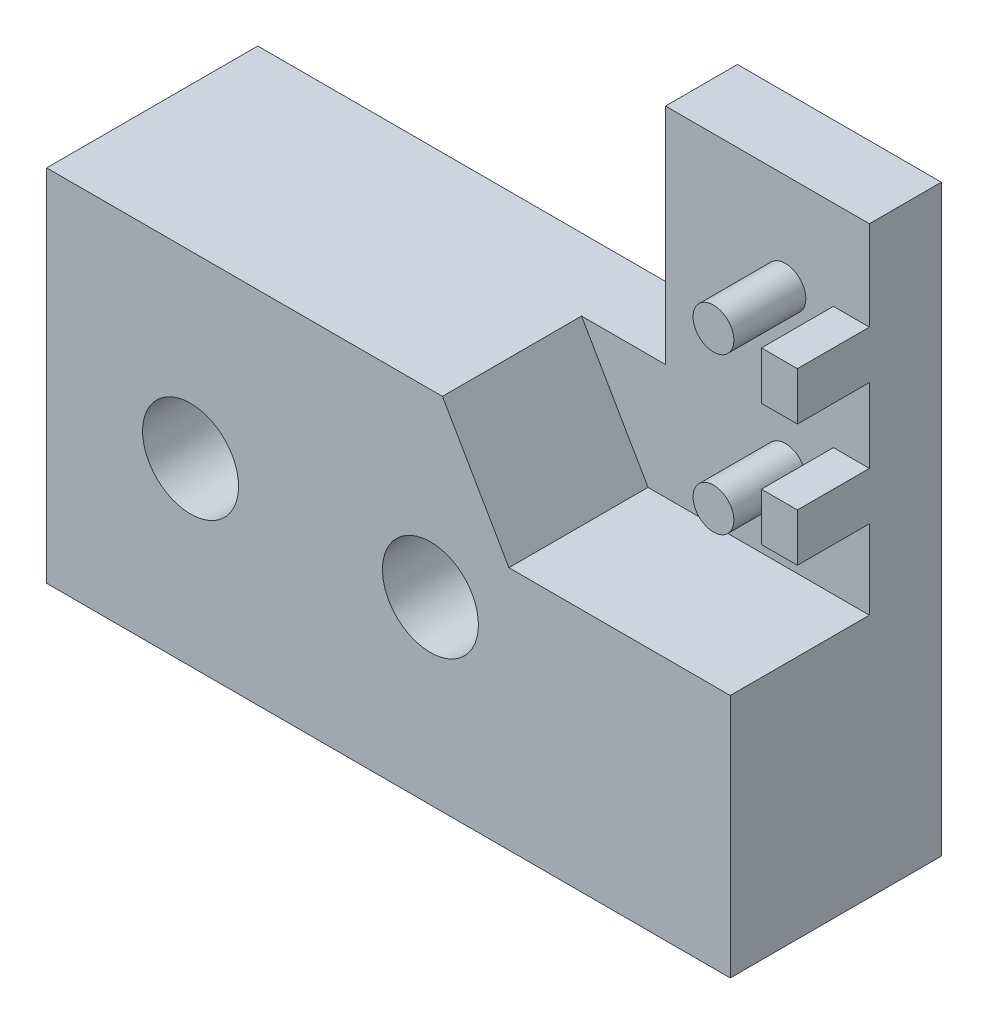
ISO-10303-21;
HEADER;
FILE_DESCRIPTION(('STEP AP214'),'2;1');
FILE_NAME('part.step','',(''),(''),'','','');
FILE_SCHEMA(('AUTOMOTIVE_DESIGN { 1 0 10303 214 1 1 1 1 }'));
ENDSEC;
DATA;
#1=APPLICATION_CONTEXT('core data for automotive mechanical design processes');
#2=APPLICATION_PROTOCOL_DEFINITION('international standard','automotive_design',2000,#1);
#3=PRODUCT_CONTEXT('',#1,'mechanical');
#4=PRODUCT('Part','Part','',(#3));
#5=PRODUCT_RELATED_PRODUCT_CATEGORY('part','',(#4));
#6=PRODUCT_DEFINITION_FORMATION('','',#4);
#7=PRODUCT_DEFINITION_CONTEXT('part definition',#1,'design');
#8=PRODUCT_DEFINITION('design','',#6,#7);
#9=PRODUCT_DEFINITION_SHAPE('','',#8);
#10=(LENGTH_UNIT() NAMED_UNIT(*) SI_UNIT(.MILLI.,.METRE.));
#11=(NAMED_UNIT(*) PLANE_ANGLE_UNIT() SI_UNIT($,.RADIAN.));
#12=(NAMED_UNIT(*) SI_UNIT($,.STERADIAN.) SOLID_ANGLE_UNIT());
#13=UNCERTAINTY_MEASURE_WITH_UNIT(LENGTH_MEASURE(1.E-05),#10,'distance_accuracy_value','');
#14=(GEOMETRIC_REPRESENTATION_CONTEXT(3) GLOBAL_UNCERTAINTY_ASSIGNED_CONTEXT((#13)) GLOBAL_UNIT_ASSIGNED_CONTEXT((#10,
#11,#12)) REPRESENTATION_CONTEXT('',''));
#15=CARTESIAN_POINT('',(0.,0.,0.));
#16=DIRECTION('',(0.,0.,1.));
#17=DIRECTION('',(1.,0.,0.));
#18=AXIS2_PLACEMENT_3D('',#15,#16,#17);
#19=CARTESIAN_POINT('',(0.,0.,3.));
#20=DIRECTION('',(0.,0.,-1.));
#21=DIRECTION('',(-1.,0.,0.));
#22=AXIS2_PLACEMENT_3D('',#19,#20,#21);
#23=PLANE('',#22);
#24=CARTESIAN_POINT('',(-3.5,20.3,3.));
#25=DIRECTION('',(0.,0.,-1.));
#26=DIRECTION('',(-1.,0.,0.));
#27=AXIS2_PLACEMENT_3D('',#24,#25,#26);
#28=CIRCLE('',#27,0.85);
#29=CARTESIAN_POINT('',(-4.35,20.3,3.));
#30=VERTEX_POINT('',#29);
#31=EDGE_CURVE('E11',#30,#30,#28,.F.);
#32=ORIENTED_EDGE('',*,*,#31,.F.);
#33=EDGE_LOOP('',(#32));
#34=FACE_BOUND('',#33,.T.);
#35=CARTESIAN_POINT('',(-3.5,13.8,3.));
#36=DIRECTION('',(0.,0.,-1.));
#37=DIRECTION('',(-1.,0.,0.));
#38=AXIS2_PLACEMENT_3D('',#35,#36,#37);
#39=CIRCLE('',#38,0.85);
#40=CARTESIAN_POINT('',(-4.35,13.8,3.));
#41=VERTEX_POINT('',#40);
#42=EDGE_CURVE('E54',#41,#41,#39,.F.);
#43=ORIENTED_EDGE('',*,*,#42,.F.);
#44=EDGE_LOOP('',(#43));
#45=FACE_BOUND('',#44,.T.);
#46=DIRECTION('',(0.,1.,0.));
#47=VECTOR('',#46,1.);
#48=CARTESIAN_POINT('',(-1.5,0.,3.));
#49=LINE('',#48,#47);
#50=CARTESIAN_POINT('',(-1.5,13.5,3.));
#51=VERTEX_POINT('',#50);
#52=CARTESIAN_POINT('',(-1.5,15.5,3.));
#53=VERTEX_POINT('',#52);
#54=EDGE_CURVE('E61',#51,#53,#49,.T.);
#55=ORIENTED_EDGE('',*,*,#54,.T.);
#56=DIRECTION('',(1.,0.,0.));
#57=VECTOR('',#56,1.);
#58=CARTESIAN_POINT('',(0.,15.5,3.));
#59=LINE('',#58,#57);
#60=CARTESIAN_POINT('',(0.,15.5,3.));
#61=VERTEX_POINT('',#60);
#62=EDGE_CURVE('E170',#53,#61,#59,.T.);
#63=ORIENTED_EDGE('',*,*,#62,.T.);
#64=DIRECTION('',(0.,1.,0.));
#65=VECTOR('',#64,1.);
#66=CARTESIAN_POINT('',(0.,24.333,3.));
#67=LINE('',#66,#65);
#68=CARTESIAN_POINT('',(0.,18.6,3.));
#69=VERTEX_POINT('',#68);
#70=EDGE_CURVE('E300',#61,#69,#67,.T.);
#71=ORIENTED_EDGE('',*,*,#70,.T.);
#72=DIRECTION('',(1.,0.,0.));
#73=VECTOR('',#72,1.);
#74=CARTESIAN_POINT('',(0.,18.6,3.));
#75=LINE('',#74,#73);
#76=CARTESIAN_POINT('',(-1.5,18.6,3.));
#77=VERTEX_POINT('',#76);
#78=EDGE_CURVE('E219',#77,#69,#75,.T.);
#79=ORIENTED_EDGE('',*,*,#78,.F.);
#80=DIRECTION('',(0.,-1.,0.));
#81=VECTOR('',#80,1.);
#82=CARTESIAN_POINT('',(-1.5,0.,3.));
#83=LINE('',#82,#81);
#84=CARTESIAN_POINT('',(-1.5,20.6,3.));
#85=VERTEX_POINT('',#84);
#86=EDGE_CURVE('E232',#85,#77,#83,.T.);
#87=ORIENTED_EDGE('',*,*,#86,.F.);
#88=DIRECTION('',(-1.,0.,0.));
#89=VECTOR('',#88,1.);
#90=CARTESIAN_POINT('',(0.,20.6,3.));
#91=LINE('',#90,#89);
#92=CARTESIAN_POINT('',(0.,20.6,3.));
#93=VERTEX_POINT('',#92);
#94=EDGE_CURVE('E174',#93,#85,#91,.T.);
#95=ORIENTED_EDGE('',*,*,#94,.F.);
#96=CARTESIAN_POINT('',(0.,24.333,3.));
#97=VERTEX_POINT('',#96);
#98=EDGE_CURVE('E301',#93,#97,#67,.T.);
#99=ORIENTED_EDGE('',*,*,#98,.T.);
#100=DIRECTION('',(-1.,0.,0.));
#101=VECTOR('',#100,1.);
#102=CARTESIAN_POINT('',(-8.5,24.333,3.));
#103=LINE('',#102,#101);
#104=CARTESIAN_POINT('',(-8.5,24.333,3.));
#105=VERTEX_POINT('',#104);
#106=EDGE_CURVE('E299',#97,#105,#103,.T.);
#107=ORIENTED_EDGE('',*,*,#106,.T.);
#108=DIRECTION('',(0.,-1.,0.));
#109=VECTOR('',#108,1.);
#110=CARTESIAN_POINT('',(-8.5,15.,3.));
#111=LINE('',#110,#109);
#112=CARTESIAN_POINT('',(-8.5,15.,3.));
#113=VERTEX_POINT('',#112);
#114=EDGE_CURVE('E304',#105,#113,#111,.T.);
#115=ORIENTED_EDGE('',*,*,#114,.T.);
#116=DIRECTION('',(-1.,0.,0.));
#117=VECTOR('',#116,1.);
#118=CARTESIAN_POINT('',(-28.5,15.,3.));
#119=LINE('',#118,#117);
#120=CARTESIAN_POINT('',(-12.,15.,3.));
#121=VERTEX_POINT('',#120);
#122=EDGE_CURVE('E307',#113,#121,#119,.T.);
#123=ORIENTED_EDGE('',*,*,#122,.T.);
#124=DIRECTION('',(-0.499999999999998,0.86602540378444,0.));
#125=VECTOR('',#124,1.);
#126=CARTESIAN_POINT('',(-12.,15.,3.));
#127=LINE('',#126,#125);
#128=CARTESIAN_POINT('',(-9.22871870788981,10.2,3.));
#129=VERTEX_POINT('',#128);
#130=EDGE_CURVE('E260',#129,#121,#127,.T.);
#131=ORIENTED_EDGE('',*,*,#130,.F.);
#132=DIRECTION('',(-1.,0.,0.));
#133=VECTOR('',#132,1.);
#134=CARTESIAN_POINT('',(-9.22871870788981,10.2,3.));
#135=LINE('',#134,#133);
#136=CARTESIAN_POINT('',(0.,10.2,3.));
#137=VERTEX_POINT('',#136);
#138=EDGE_CURVE('E254',#137,#129,#135,.T.);
#139=ORIENTED_EDGE('',*,*,#138,.F.);
#140=CARTESIAN_POINT('',(0.,13.5,3.));
#141=VERTEX_POINT('',#140);
#142=EDGE_CURVE('E296',#137,#141,#67,.T.);
#143=ORIENTED_EDGE('',*,*,#142,.T.);
#144=DIRECTION('',(-1.,0.,0.));
#145=VECTOR('',#144,1.);
#146=CARTESIAN_POINT('',(0.,13.5,3.));
#147=LINE('',#146,#145);
#148=EDGE_CURVE('E66',#141,#51,#147,.T.);
#149=ORIENTED_EDGE('',*,*,#148,.T.);
#150=EDGE_LOOP('',(#55,#63,#71,#79,#87,#95,#99,#107,#115,#123,#131,#139,#143,#149));
#151=FACE_BOUND('',#150,.T.);
#152=ADVANCED_FACE('F45',(#34,#45,#151),#23,.F.);
#153=CARTESIAN_POINT('',(0.,24.333,3.));
#154=DIRECTION('',(-1.,0.,0.));
#155=DIRECTION('',(0.,-1.,0.));
#156=AXIS2_PLACEMENT_3D('',#153,#154,#155);
#157=PLANE('',#156);
#158=DIRECTION('',(0.,1.,0.));
#159=VECTOR('',#158,1.);
#160=CARTESIAN_POINT('',(0.,24.333,0.));
#161=LINE('',#160,#159);
#162=CARTESIAN_POINT('',(0.,0.,0.));
#163=VERTEX_POINT('',#162);
#164=CARTESIAN_POINT('',(0.,24.333,0.));
#165=VERTEX_POINT('',#164);
#166=EDGE_CURVE('E295',#163,#165,#161,.T.);
#167=ORIENTED_EDGE('',*,*,#166,.T.);
#168=DIRECTION('',(0.,0.,-1.));
#169=VECTOR('',#168,1.);
#170=CARTESIAN_POINT('',(0.,24.333,3.));
#171=LINE('',#170,#169);
#172=EDGE_CURVE('E348',#97,#165,#171,.T.);
#173=ORIENTED_EDGE('',*,*,#172,.F.);
#174=ORIENTED_EDGE('',*,*,#98,.F.);
#175=DIRECTION('',(0.,0.,-1.));
#176=VECTOR('',#175,1.);
#177=CARTESIAN_POINT('',(0.,20.6,6.));
#178=LINE('',#177,#176);
#179=CARTESIAN_POINT('',(0.,20.6,6.));
#180=VERTEX_POINT('',#179);
#181=EDGE_CURVE('E250',#180,#93,#178,.T.);
#182=ORIENTED_EDGE('',*,*,#181,.F.);
#183=DIRECTION('',(0.,1.,0.));
#184=VECTOR('',#183,1.);
#185=CARTESIAN_POINT('',(0.,0.,6.));
#186=LINE('',#185,#184);
#187=CARTESIAN_POINT('',(0.,18.6,6.));
#188=VERTEX_POINT('',#187);
#189=EDGE_CURVE('E214',#188,#180,#186,.T.);
#190=ORIENTED_EDGE('',*,*,#189,.F.);
#191=DIRECTION('',(0.,0.,-1.));
#192=VECTOR('',#191,1.);
#193=CARTESIAN_POINT('',(0.,18.6,6.));
#194=LINE('',#193,#192);
#195=EDGE_CURVE('E228',#188,#69,#194,.T.);
#196=ORIENTED_EDGE('',*,*,#195,.T.);
#197=ORIENTED_EDGE('',*,*,#70,.F.);
#198=DIRECTION('',(0.,0.,-1.));
#199=VECTOR('',#198,1.);
#200=CARTESIAN_POINT('',(0.,15.5,6.));
#201=LINE('',#200,#199);
#202=CARTESIAN_POINT('',(0.,15.5,6.));
#203=VERTEX_POINT('',#202);
#204=EDGE_CURVE('E198',#203,#61,#201,.T.);
#205=ORIENTED_EDGE('',*,*,#204,.F.);
#206=DIRECTION('',(0.,1.,0.));
#207=VECTOR('',#206,1.);
#208=CARTESIAN_POINT('',(0.,0.,6.));
#209=LINE('',#208,#207);
#210=CARTESIAN_POINT('',(0.,13.5,6.));
#211=VERTEX_POINT('',#210);
#212=EDGE_CURVE('E184',#211,#203,#209,.T.);
#213=ORIENTED_EDGE('',*,*,#212,.F.);
#214=DIRECTION('',(0.,0.,-1.));
#215=VECTOR('',#214,1.);
#216=CARTESIAN_POINT('',(0.,13.5,6.));
#217=LINE('',#216,#215);
#218=EDGE_CURVE('E208',#211,#141,#217,.T.);
#219=ORIENTED_EDGE('',*,*,#218,.T.);
#220=ORIENTED_EDGE('',*,*,#142,.F.);
#221=DIRECTION('',(0.,0.,-1.));
#222=VECTOR('',#221,1.);
#223=CARTESIAN_POINT('',(0.,10.2,8.8));
#224=LINE('',#223,#222);
#225=CARTESIAN_POINT('',(0.,10.2,8.8));
#226=VERTEX_POINT('',#225);
#227=EDGE_CURVE('E291',#226,#137,#224,.T.);
#228=ORIENTED_EDGE('',*,*,#227,.F.);
#229=DIRECTION('',(0.,1.,0.));
#230=VECTOR('',#229,1.);
#231=CARTESIAN_POINT('',(0.,0.,8.8));
#232=LINE('',#231,#230);
#233=CARTESIAN_POINT('',(0.,0.,8.8));
#234=VERTEX_POINT('',#233);
#235=EDGE_CURVE('E268',#234,#226,#232,.T.);
#236=ORIENTED_EDGE('',*,*,#235,.F.);
#237=DIRECTION('',(0.,0.,-1.));
#238=VECTOR('',#237,1.);
#239=CARTESIAN_POINT('',(0.,0.,3.));
#240=LINE('',#239,#238);
#241=EDGE_CURVE('E310',#234,#163,#240,.T.);
#242=ORIENTED_EDGE('',*,*,#241,.T.);
#243=EDGE_LOOP('',(#167,#173,#174,#182,#190,#196,#197,#205,#213,#219,#220,#228,#236,#242));
#244=FACE_BOUND('',#243,.T.);
#245=ADVANCED_FACE('F47',(#244),#157,.F.);
#246=CARTESIAN_POINT('',(-8.5,24.333,3.));
#247=DIRECTION('',(0.,-1.,0.));
#248=DIRECTION('',(0.,0.,-1.));
#249=AXIS2_PLACEMENT_3D('',#246,#247,#248);
#250=PLANE('',#249);
#251=DIRECTION('',(-1.,0.,0.));
#252=VECTOR('',#251,1.);
#253=CARTESIAN_POINT('',(-8.5,24.333,0.));
#254=LINE('',#253,#252);
#255=CARTESIAN_POINT('',(-8.5,24.333,0.));
#256=VERTEX_POINT('',#255);
#257=EDGE_CURVE('E314',#165,#256,#254,.T.);
#258=ORIENTED_EDGE('',*,*,#257,.T.);
#259=DIRECTION('',(0.,0.,-1.));
#260=VECTOR('',#259,1.);
#261=CARTESIAN_POINT('',(-8.5,24.333,3.));
#262=LINE('',#261,#260);
#263=EDGE_CURVE('E344',#105,#256,#262,.T.);
#264=ORIENTED_EDGE('',*,*,#263,.F.);
#265=ORIENTED_EDGE('',*,*,#106,.F.);
#266=ORIENTED_EDGE('',*,*,#172,.T.);
#267=EDGE_LOOP('',(#258,#264,#265,#266));
#268=FACE_BOUND('',#267,.T.);
#269=ADVANCED_FACE('F363',(#268),#250,.F.);
#270=CARTESIAN_POINT('',(-8.5,15.,3.));
#271=DIRECTION('',(1.,0.,0.));
#272=DIRECTION('',(0.,0.,-1.));
#273=AXIS2_PLACEMENT_3D('',#270,#271,#272);
#274=PLANE('',#273);
#275=DIRECTION('',(0.,-1.,0.));
#276=VECTOR('',#275,1.);
#277=CARTESIAN_POINT('',(-8.5,15.,0.));
#278=LINE('',#277,#276);
#279=CARTESIAN_POINT('',(-8.5,15.,0.));
#280=VERTEX_POINT('',#279);
#281=EDGE_CURVE('E317',#256,#280,#278,.T.);
#282=ORIENTED_EDGE('',*,*,#281,.T.);
#283=DIRECTION('',(0.,0.,-1.));
#284=VECTOR('',#283,1.);
#285=CARTESIAN_POINT('',(-8.5,15.,3.));
#286=LINE('',#285,#284);
#287=EDGE_CURVE('E340',#113,#280,#286,.T.);
#288=ORIENTED_EDGE('',*,*,#287,.F.);
#289=ORIENTED_EDGE('',*,*,#114,.F.);
#290=ORIENTED_EDGE('',*,*,#263,.T.);
#291=EDGE_LOOP('',(#282,#288,#289,#290));
#292=FACE_BOUND('',#291,.T.);
#293=ADVANCED_FACE('F385',(#292),#274,.F.);
#294=CARTESIAN_POINT('',(-28.5,15.,3.));
#295=DIRECTION('',(0.,-1.,0.));
#296=DIRECTION('',(0.,0.,-1.));
#297=AXIS2_PLACEMENT_3D('',#294,#295,#296);
#298=PLANE('',#297);
#299=DIRECTION('',(-1.,0.,0.));
#300=VECTOR('',#299,1.);
#301=CARTESIAN_POINT('',(-28.5,15.,0.));
#302=LINE('',#301,#300);
#303=CARTESIAN_POINT('',(-28.5,15.,0.));
#304=VERTEX_POINT('',#303);
#305=EDGE_CURVE('E320',#280,#304,#302,.T.);
#306=ORIENTED_EDGE('',*,*,#305,.T.);
#307=DIRECTION('',(0.,0.,-1.));
#308=VECTOR('',#307,1.);
#309=CARTESIAN_POINT('',(-28.5,15.,3.));
#310=LINE('',#309,#308);
#311=CARTESIAN_POINT('',(-28.5,15.,8.8));
#312=VERTEX_POINT('',#311);
#313=EDGE_CURVE('E336',#312,#304,#310,.T.);
#314=ORIENTED_EDGE('',*,*,#313,.F.);
#315=DIRECTION('',(-1.,0.,0.));
#316=VECTOR('',#315,1.);
#317=CARTESIAN_POINT('',(-12.,15.,8.8));
#318=LINE('',#317,#316);
#319=CARTESIAN_POINT('',(-12.,15.,8.8));
#320=VERTEX_POINT('',#319);
#321=EDGE_CURVE('E255',#320,#312,#318,.T.);
#322=ORIENTED_EDGE('',*,*,#321,.F.);
#323=DIRECTION('',(0.,0.,-1.));
#324=VECTOR('',#323,1.);
#325=CARTESIAN_POINT('',(-12.,15.,8.8));
#326=LINE('',#325,#324);
#327=EDGE_CURVE('E277',#320,#121,#326,.T.);
#328=ORIENTED_EDGE('',*,*,#327,.T.);
#329=ORIENTED_EDGE('',*,*,#122,.F.);
#330=ORIENTED_EDGE('',*,*,#287,.T.);
#331=EDGE_LOOP('',(#306,#314,#322,#328,#329,#330));
#332=FACE_BOUND('',#331,.T.);
#333=ADVANCED_FACE('F381',(#332),#298,.F.);
#334=CARTESIAN_POINT('',(-28.5,0.,3.));
#335=DIRECTION('',(1.,0.,0.));
#336=DIRECTION('',(0.,0.,-1.));
#337=AXIS2_PLACEMENT_3D('',#334,#335,#336);
#338=PLANE('',#337);
#339=DIRECTION('',(0.,-1.,0.));
#340=VECTOR('',#339,1.);
#341=CARTESIAN_POINT('',(-28.5,0.,0.));
#342=LINE('',#341,#340);
#343=CARTESIAN_POINT('',(-28.5,0.,0.));
#344=VERTEX_POINT('',#343);
#345=EDGE_CURVE('E323',#304,#344,#342,.T.);
#346=ORIENTED_EDGE('',*,*,#345,.T.);
#347=DIRECTION('',(0.,0.,-1.));
#348=VECTOR('',#347,1.);
#349=CARTESIAN_POINT('',(-28.5,0.,3.));
#350=LINE('',#349,#348);
#351=CARTESIAN_POINT('',(-28.5,0.,8.8));
#352=VERTEX_POINT('',#351);
#353=EDGE_CURVE('E332',#352,#344,#350,.T.);
#354=ORIENTED_EDGE('',*,*,#353,.F.);
#355=DIRECTION('',(0.,-1.,0.));
#356=VECTOR('',#355,1.);
#357=CARTESIAN_POINT('',(-28.5,15.,8.8));
#358=LINE('',#357,#356);
#359=EDGE_CURVE('E259',#312,#352,#358,.T.);
#360=ORIENTED_EDGE('',*,*,#359,.F.);
#361=ORIENTED_EDGE('',*,*,#313,.T.);
#362=EDGE_LOOP('',(#346,#354,#360,#361));
#363=FACE_BOUND('',#362,.T.);
#364=ADVANCED_FACE('F377',(#363),#338,.F.);
#365=CARTESIAN_POINT('',(0.,0.,3.));
#366=DIRECTION('',(0.,1.,0.));
#367=DIRECTION('',(0.,0.,1.));
#368=AXIS2_PLACEMENT_3D('',#365,#366,#367);
#369=PLANE('',#368);
#370=DIRECTION('',(1.,0.,0.));
#371=VECTOR('',#370,1.);
#372=CARTESIAN_POINT('',(0.,0.,0.));
#373=LINE('',#372,#371);
#374=EDGE_CURVE('E326',#344,#163,#373,.T.);
#375=ORIENTED_EDGE('',*,*,#374,.T.);
#376=ORIENTED_EDGE('',*,*,#241,.F.);
#377=DIRECTION('',(1.,0.,0.));
#378=VECTOR('',#377,1.);
#379=CARTESIAN_POINT('',(-28.5,0.,8.8));
#380=LINE('',#379,#378);
#381=EDGE_CURVE('E264',#352,#234,#380,.T.);
#382=ORIENTED_EDGE('',*,*,#381,.F.);
#383=ORIENTED_EDGE('',*,*,#353,.T.);
#384=EDGE_LOOP('',(#375,#376,#382,#383));
#385=FACE_BOUND('',#384,.T.);
#386=ADVANCED_FACE('F373',(#385),#369,.F.);
#387=CARTESIAN_POINT('',(0.,0.,0.));
#388=DIRECTION('',(0.,0.,-1.));
#389=DIRECTION('',(-1.,0.,0.));
#390=AXIS2_PLACEMENT_3D('',#387,#388,#389);
#391=PLANE('',#390);
#392=CARTESIAN_POINT('',(-22.5,7.5,0.));
#393=DIRECTION('',(0.,0.,-1.));
#394=DIRECTION('',(-1.,0.,0.));
#395=AXIS2_PLACEMENT_3D('',#392,#393,#394);
#396=CIRCLE('',#395,2.);
#397=CARTESIAN_POINT('',(-24.5,7.5,0.));
#398=VERTEX_POINT('',#397);
#399=EDGE_CURVE('E690',#398,#398,#396,.F.);
#400=ORIENTED_EDGE('',*,*,#399,.T.);
#401=EDGE_LOOP('',(#400));
#402=FACE_BOUND('',#401,.T.);
#403=CARTESIAN_POINT('',(-12.5,7.5,0.));
#404=DIRECTION('',(0.,0.,-1.));
#405=DIRECTION('',(-1.,0.,0.));
#406=AXIS2_PLACEMENT_3D('',#403,#404,#405);
#407=CIRCLE('',#406,2.);
#408=CARTESIAN_POINT('',(-14.5,7.5,0.));
#409=VERTEX_POINT('',#408);
#410=EDGE_CURVE('E698',#409,#409,#407,.F.);
#411=ORIENTED_EDGE('',*,*,#410,.T.);
#412=EDGE_LOOP('',(#411));
#413=FACE_BOUND('',#412,.T.);
#414=ORIENTED_EDGE('',*,*,#166,.F.);
#415=ORIENTED_EDGE('',*,*,#374,.F.);
#416=ORIENTED_EDGE('',*,*,#345,.F.);
#417=ORIENTED_EDGE('',*,*,#305,.F.);
#418=ORIENTED_EDGE('',*,*,#281,.F.);
#419=ORIENTED_EDGE('',*,*,#257,.F.);
#420=EDGE_LOOP('',(#414,#415,#416,#417,#418,#419));
#421=FACE_BOUND('',#420,.T.);
#422=ADVANCED_FACE('F370',(#402,#413,#421),#391,.T.);
#423=CARTESIAN_POINT('',(-9.22871870788981,10.2,8.8));
#424=DIRECTION('',(0.,-1.,0.));
#425=DIRECTION('',(0.,0.,-1.));
#426=AXIS2_PLACEMENT_3D('',#423,#424,#425);
#427=PLANE('',#426);
#428=ORIENTED_EDGE('',*,*,#138,.T.);
#429=DIRECTION('',(0.,0.,-1.));
#430=VECTOR('',#429,1.);
#431=CARTESIAN_POINT('',(-9.22871870788981,10.2,8.8));
#432=LINE('',#431,#430);
#433=CARTESIAN_POINT('',(-9.22871870788981,10.2,8.8));
#434=VERTEX_POINT('',#433);
#435=EDGE_CURVE('E287',#434,#129,#432,.T.);
#436=ORIENTED_EDGE('',*,*,#435,.F.);
#437=DIRECTION('',(-1.,0.,0.));
#438=VECTOR('',#437,1.);
#439=CARTESIAN_POINT('',(-9.22871870788981,10.2,8.8));
#440=LINE('',#439,#438);
#441=EDGE_CURVE('E271',#226,#434,#440,.T.);
#442=ORIENTED_EDGE('',*,*,#441,.F.);
#443=ORIENTED_EDGE('',*,*,#227,.T.);
#444=EDGE_LOOP('',(#428,#436,#442,#443));
#445=FACE_BOUND('',#444,.T.);
#446=ADVANCED_FACE('F368',(#445),#427,.F.);
#447=CARTESIAN_POINT('',(-12.,15.,8.8));
#448=DIRECTION('',(-0.86602540378444,-0.499999999999998,0.));
#449=DIRECTION('',(0.499999999999998,-0.86602540378444,0.));
#450=AXIS2_PLACEMENT_3D('',#447,#448,#449);
#451=PLANE('',#450);
#452=ORIENTED_EDGE('',*,*,#130,.T.);
#453=ORIENTED_EDGE('',*,*,#327,.F.);
#454=DIRECTION('',(-0.499999999999998,0.86602540378444,0.));
#455=VECTOR('',#454,1.);
#456=CARTESIAN_POINT('',(-12.,15.,8.8));
#457=LINE('',#456,#455);
#458=EDGE_CURVE('E274',#434,#320,#457,.T.);
#459=ORIENTED_EDGE('',*,*,#458,.F.);
#460=ORIENTED_EDGE('',*,*,#435,.T.);
#461=EDGE_LOOP('',(#452,#453,#459,#460));
#462=FACE_BOUND('',#461,.T.);
#463=ADVANCED_FACE('F413',(#462),#451,.F.);
#464=CARTESIAN_POINT('',(0.,0.,8.8));
#465=DIRECTION('',(0.,0.,1.));
#466=DIRECTION('',(1.,0.,0.));
#467=AXIS2_PLACEMENT_3D('',#464,#465,#466);
#468=PLANE('',#467);
#469=CARTESIAN_POINT('',(-22.5,7.5,8.8));
#470=DIRECTION('',(0.,0.,1.));
#471=DIRECTION('',(1.,0.,0.));
#472=AXIS2_PLACEMENT_3D('',#469,#470,#471);
#473=CIRCLE('',#472,2.);
#474=CARTESIAN_POINT('',(-20.5,7.5,8.8));
#475=VERTEX_POINT('',#474);
#476=EDGE_CURVE('E687',#475,#475,#473,.T.);
#477=ORIENTED_EDGE('',*,*,#476,.F.);
#478=EDGE_LOOP('',(#477));
#479=FACE_BOUND('',#478,.T.);
#480=CARTESIAN_POINT('',(-12.5,7.5,8.8));
#481=DIRECTION('',(0.,0.,1.));
#482=DIRECTION('',(1.,0.,0.));
#483=AXIS2_PLACEMENT_3D('',#480,#481,#482);
#484=CIRCLE('',#483,2.);
#485=CARTESIAN_POINT('',(-10.5,7.5,8.8));
#486=VERTEX_POINT('',#485);
#487=EDGE_CURVE('E701',#486,#486,#484,.T.);
#488=ORIENTED_EDGE('',*,*,#487,.F.);
#489=EDGE_LOOP('',(#488));
#490=FACE_BOUND('',#489,.T.);
#491=ORIENTED_EDGE('',*,*,#321,.T.);
#492=ORIENTED_EDGE('',*,*,#359,.T.);
#493=ORIENTED_EDGE('',*,*,#381,.T.);
#494=ORIENTED_EDGE('',*,*,#235,.T.);
#495=ORIENTED_EDGE('',*,*,#441,.T.);
#496=ORIENTED_EDGE('',*,*,#458,.T.);
#497=EDGE_LOOP('',(#491,#492,#493,#494,#495,#496));
#498=FACE_BOUND('',#497,.T.);
#499=ADVANCED_FACE('F409',(#479,#490,#498),#468,.T.);
#500=CARTESIAN_POINT('',(0.,20.6,6.));
#501=DIRECTION('',(0.,-1.,0.));
#502=DIRECTION('',(0.,0.,-1.));
#503=AXIS2_PLACEMENT_3D('',#500,#501,#502);
#504=PLANE('',#503);
#505=ORIENTED_EDGE('',*,*,#94,.T.);
#506=DIRECTION('',(0.,0.,-1.));
#507=VECTOR('',#506,1.);
#508=CARTESIAN_POINT('',(-1.5,20.6,6.));
#509=LINE('',#508,#507);
#510=CARTESIAN_POINT('',(-1.5,20.6,6.));
#511=VERTEX_POINT('',#510);
#512=EDGE_CURVE('E246',#511,#85,#509,.T.);
#513=ORIENTED_EDGE('',*,*,#512,.F.);
#514=DIRECTION('',(-1.,0.,0.));
#515=VECTOR('',#514,1.);
#516=CARTESIAN_POINT('',(0.,20.6,6.));
#517=LINE('',#516,#515);
#518=EDGE_CURVE('E218',#180,#511,#517,.T.);
#519=ORIENTED_EDGE('',*,*,#518,.F.);
#520=ORIENTED_EDGE('',*,*,#181,.T.);
#521=EDGE_LOOP('',(#505,#513,#519,#520));
#522=FACE_BOUND('',#521,.T.);
#523=ADVANCED_FACE('F445',(#522),#504,.F.);
#524=CARTESIAN_POINT('',(-1.5,0.,6.));
#525=DIRECTION('',(1.,0.,0.));
#526=DIRECTION('',(0.,1.,0.));
#527=AXIS2_PLACEMENT_3D('',#524,#525,#526);
#528=PLANE('',#527);
#529=ORIENTED_EDGE('',*,*,#86,.T.);
#530=DIRECTION('',(0.,0.,-1.));
#531=VECTOR('',#530,1.);
#532=CARTESIAN_POINT('',(-1.5,18.6,6.));
#533=LINE('',#532,#531);
#534=CARTESIAN_POINT('',(-1.5,18.6,6.));
#535=VERTEX_POINT('',#534);
#536=EDGE_CURVE('E242',#535,#77,#533,.T.);
#537=ORIENTED_EDGE('',*,*,#536,.F.);
#538=DIRECTION('',(0.,-1.,0.));
#539=VECTOR('',#538,1.);
#540=CARTESIAN_POINT('',(-1.5,0.,6.));
#541=LINE('',#540,#539);
#542=EDGE_CURVE('E222',#511,#535,#541,.T.);
#543=ORIENTED_EDGE('',*,*,#542,.F.);
#544=ORIENTED_EDGE('',*,*,#512,.T.);
#545=EDGE_LOOP('',(#529,#537,#543,#544));
#546=FACE_BOUND('',#545,.T.);
#547=ADVANCED_FACE('F441',(#546),#528,.F.);
#548=CARTESIAN_POINT('',(0.,18.6,6.));
#549=DIRECTION('',(0.,1.,0.));
#550=DIRECTION('',(0.,0.,1.));
#551=AXIS2_PLACEMENT_3D('',#548,#549,#550);
#552=PLANE('',#551);
#553=ORIENTED_EDGE('',*,*,#78,.T.);
#554=ORIENTED_EDGE('',*,*,#195,.F.);
#555=DIRECTION('',(1.,0.,0.));
#556=VECTOR('',#555,1.);
#557=CARTESIAN_POINT('',(0.,18.6,6.));
#558=LINE('',#557,#556);
#559=EDGE_CURVE('E225',#535,#188,#558,.T.);
#560=ORIENTED_EDGE('',*,*,#559,.F.);
#561=ORIENTED_EDGE('',*,*,#536,.T.);
#562=EDGE_LOOP('',(#553,#554,#560,#561));
#563=FACE_BOUND('',#562,.T.);
#564=ADVANCED_FACE('F437',(#563),#552,.F.);
#565=CARTESIAN_POINT('',(0.,0.,6.));
#566=DIRECTION('',(0.,0.,1.));
#567=DIRECTION('',(1.,0.,0.));
#568=AXIS2_PLACEMENT_3D('',#565,#566,#567);
#569=PLANE('',#568);
#570=ORIENTED_EDGE('',*,*,#189,.T.);
#571=ORIENTED_EDGE('',*,*,#518,.T.);
#572=ORIENTED_EDGE('',*,*,#542,.T.);
#573=ORIENTED_EDGE('',*,*,#559,.T.);
#574=EDGE_LOOP('',(#570,#571,#572,#573));
#575=FACE_BOUND('',#574,.T.);
#576=ADVANCED_FACE('F434',(#575),#569,.T.);
#577=CARTESIAN_POINT('',(0.,15.5,6.));
#578=DIRECTION('',(0.,1.,0.));
#579=DIRECTION('',(0.,0.,1.));
#580=AXIS2_PLACEMENT_3D('',#577,#578,#579);
#581=PLANE('',#580);
#582=ORIENTED_EDGE('',*,*,#62,.F.);
#583=DIRECTION('',(0.,0.,-1.));
#584=VECTOR('',#583,1.);
#585=CARTESIAN_POINT('',(-1.5,15.5,6.));
#586=LINE('',#585,#584);
#587=CARTESIAN_POINT('',(-1.5,15.5,6.));
#588=VERTEX_POINT('',#587);
#589=EDGE_CURVE('E165',#588,#53,#586,.T.);
#590=ORIENTED_EDGE('',*,*,#589,.F.);
#591=DIRECTION('',(1.,0.,0.));
#592=VECTOR('',#591,1.);
#593=CARTESIAN_POINT('',(0.,15.5,6.));
#594=LINE('',#593,#592);
#595=EDGE_CURVE('E169',#588,#203,#594,.T.);
#596=ORIENTED_EDGE('',*,*,#595,.T.);
#597=ORIENTED_EDGE('',*,*,#204,.T.);
#598=EDGE_LOOP('',(#582,#590,#596,#597));
#599=FACE_BOUND('',#598,.T.);
#600=ADVANCED_FACE('F167',(#599),#581,.T.);
#601=CARTESIAN_POINT('',(-1.5,0.,6.));
#602=DIRECTION('',(-1.,0.,0.));
#603=DIRECTION('',(0.,-1.,0.));
#604=AXIS2_PLACEMENT_3D('',#601,#602,#603);
#605=PLANE('',#604);
#606=ORIENTED_EDGE('',*,*,#54,.F.);
#607=DIRECTION('',(0.,0.,-1.));
#608=VECTOR('',#607,1.);
#609=CARTESIAN_POINT('',(-1.5,13.5,6.));
#610=LINE('',#609,#608);
#611=CARTESIAN_POINT('',(-1.5,13.5,6.));
#612=VERTEX_POINT('',#611);
#613=EDGE_CURVE('E175',#612,#51,#610,.T.);
#614=ORIENTED_EDGE('',*,*,#613,.F.);
#615=DIRECTION('',(0.,1.,0.));
#616=VECTOR('',#615,1.);
#617=CARTESIAN_POINT('',(-1.5,0.,6.));
#618=LINE('',#617,#616);
#619=EDGE_CURVE('E181',#612,#588,#618,.T.);
#620=ORIENTED_EDGE('',*,*,#619,.T.);
#621=ORIENTED_EDGE('',*,*,#589,.T.);
#622=EDGE_LOOP('',(#606,#614,#620,#621));
#623=FACE_BOUND('',#622,.T.);
#624=ADVANCED_FACE('F188',(#623),#605,.T.);
#625=CARTESIAN_POINT('',(0.,13.5,6.));
#626=DIRECTION('',(0.,-1.,0.));
#627=DIRECTION('',(0.,0.,-1.));
#628=AXIS2_PLACEMENT_3D('',#625,#626,#627);
#629=PLANE('',#628);
#630=ORIENTED_EDGE('',*,*,#148,.F.);
#631=ORIENTED_EDGE('',*,*,#218,.F.);
#632=DIRECTION('',(-1.,0.,0.));
#633=VECTOR('',#632,1.);
#634=CARTESIAN_POINT('',(0.,13.5,6.));
#635=LINE('',#634,#633);
#636=EDGE_CURVE('E190',#211,#612,#635,.T.);
#637=ORIENTED_EDGE('',*,*,#636,.T.);
#638=ORIENTED_EDGE('',*,*,#613,.T.);
#639=EDGE_LOOP('',(#630,#631,#637,#638));
#640=FACE_BOUND('',#639,.T.);
#641=ADVANCED_FACE('F421',(#640),#629,.T.);
#642=CARTESIAN_POINT('',(0.,0.,6.));
#643=DIRECTION('',(0.,0.,1.));
#644=DIRECTION('',(1.,0.,0.));
#645=AXIS2_PLACEMENT_3D('',#642,#643,#644);
#646=PLANE('',#645);
#647=ORIENTED_EDGE('',*,*,#595,.F.);
#648=ORIENTED_EDGE('',*,*,#619,.F.);
#649=ORIENTED_EDGE('',*,*,#636,.F.);
#650=ORIENTED_EDGE('',*,*,#212,.T.);
#651=EDGE_LOOP('',(#647,#648,#649,#650));
#652=FACE_BOUND('',#651,.T.);
#653=ADVANCED_FACE('F179',(#652),#646,.T.);
#654=CARTESIAN_POINT('',(-3.5,13.8,6.));
#655=DIRECTION('',(0.,0.,-1.));
#656=DIRECTION('',(-1.,0.,0.));
#657=AXIS2_PLACEMENT_3D('',#654,#655,#656);
#658=CYLINDRICAL_SURFACE('',#657,0.85);
#659=CARTESIAN_POINT('',(-3.5,13.8,6.));
#660=DIRECTION('',(0.,0.,1.));
#661=DIRECTION('',(1.,0.,0.));
#662=AXIS2_PLACEMENT_3D('',#659,#660,#661);
#663=CIRCLE('',#662,0.85);
#664=CARTESIAN_POINT('',(-2.65,13.8,6.));
#665=VERTEX_POINT('',#664);
#666=EDGE_CURVE('E201',#665,#665,#663,.T.);
#667=ORIENTED_EDGE('',*,*,#666,.F.);
#668=EDGE_LOOP('',(#667));
#669=FACE_BOUND('',#668,.T.);
#670=ORIENTED_EDGE('',*,*,#42,.T.);
#671=EDGE_LOOP('',(#670));
#672=FACE_BOUND('',#671,.T.);
#673=ADVANCED_FACE('F355',(#669,#672),#658,.T.);
#674=CARTESIAN_POINT('',(0.,0.,6.));
#675=DIRECTION('',(0.,0.,1.));
#676=DIRECTION('',(1.,0.,0.));
#677=AXIS2_PLACEMENT_3D('',#674,#675,#676);
#678=PLANE('',#677);
#679=ORIENTED_EDGE('',*,*,#666,.T.);
#680=EDGE_LOOP('',(#679));
#681=FACE_BOUND('',#680,.T.);
#682=ADVANCED_FACE('F613',(#681),#678,.T.);
#683=CARTESIAN_POINT('',(-3.5,20.3,6.));
#684=DIRECTION('',(0.,0.,-1.));
#685=DIRECTION('',(-1.,0.,0.));
#686=AXIS2_PLACEMENT_3D('',#683,#684,#685);
#687=CYLINDRICAL_SURFACE('',#686,0.85);
#688=CARTESIAN_POINT('',(-3.5,20.3,6.));
#689=DIRECTION('',(0.,0.,1.));
#690=DIRECTION('',(1.,0.,0.));
#691=AXIS2_PLACEMENT_3D('',#688,#689,#690);
#692=CIRCLE('',#691,0.85);
#693=CARTESIAN_POINT('',(-2.65,20.3,6.));
#694=VERTEX_POINT('',#693);
#695=EDGE_CURVE('E692',#694,#694,#692,.T.);
#696=ORIENTED_EDGE('',*,*,#695,.F.);
#697=EDGE_LOOP('',(#696));
#698=FACE_BOUND('',#697,.T.);
#699=ORIENTED_EDGE('',*,*,#31,.T.);
#700=EDGE_LOOP('',(#699));
#701=FACE_BOUND('',#700,.T.);
#702=ADVANCED_FACE('F623',(#698,#701),#687,.T.);
#703=CARTESIAN_POINT('',(0.,0.,6.));
#704=DIRECTION('',(0.,0.,1.));
#705=DIRECTION('',(1.,0.,0.));
#706=AXIS2_PLACEMENT_3D('',#703,#704,#705);
#707=PLANE('',#706);
#708=ORIENTED_EDGE('',*,*,#695,.T.);
#709=EDGE_LOOP('',(#708));
#710=FACE_BOUND('',#709,.T.);
#711=ADVANCED_FACE('F633',(#710),#707,.T.);
#712=CARTESIAN_POINT('',(-12.5,7.5,-5.65685424949239));
#713=DIRECTION('',(0.,0.,1.));
#714=DIRECTION('',(1.,0.,0.));
#715=AXIS2_PLACEMENT_3D('',#712,#713,#714);
#716=CYLINDRICAL_SURFACE('',#715,2.);
#717=ORIENTED_EDGE('',*,*,#487,.T.);
#718=EDGE_LOOP('',(#717));
#719=FACE_BOUND('',#718,.T.);
#720=ORIENTED_EDGE('',*,*,#410,.F.);
#721=EDGE_LOOP('',(#720));
#722=FACE_BOUND('',#721,.T.);
#723=ADVANCED_FACE('F643',(#719,#722),#716,.F.);
#724=CARTESIAN_POINT('',(-22.5,7.5,-5.65685424949239));
#725=DIRECTION('',(0.,0.,1.));
#726=DIRECTION('',(1.,0.,0.));
#727=AXIS2_PLACEMENT_3D('',#724,#725,#726);
#728=CYLINDRICAL_SURFACE('',#727,2.);
#729=ORIENTED_EDGE('',*,*,#476,.T.);
#730=EDGE_LOOP('',(#729));
#731=FACE_BOUND('',#730,.T.);
#732=ORIENTED_EDGE('',*,*,#399,.F.);
#733=EDGE_LOOP('',(#732));
#734=FACE_BOUND('',#733,.T.);
#735=ADVANCED_FACE('F654',(#731,#734),#728,.F.);
#736=CLOSED_SHELL('',(#152,#245,#269,#293,#333,#364,#386,#422,#446,#463,#499,#523,#547,#564,
#576,#600,#624,#641,#653,#673,#682,#702,#711,#723,#735));
#737=MANIFOLD_SOLID_BREP('B2',#736);
#738=ADVANCED_BREP_SHAPE_REPRESENTATION('',(#18,#737),#14);
#739=SHAPE_DEFINITION_REPRESENTATION(#9,#738);
ENDSEC;
END-ISO-10303-21;
